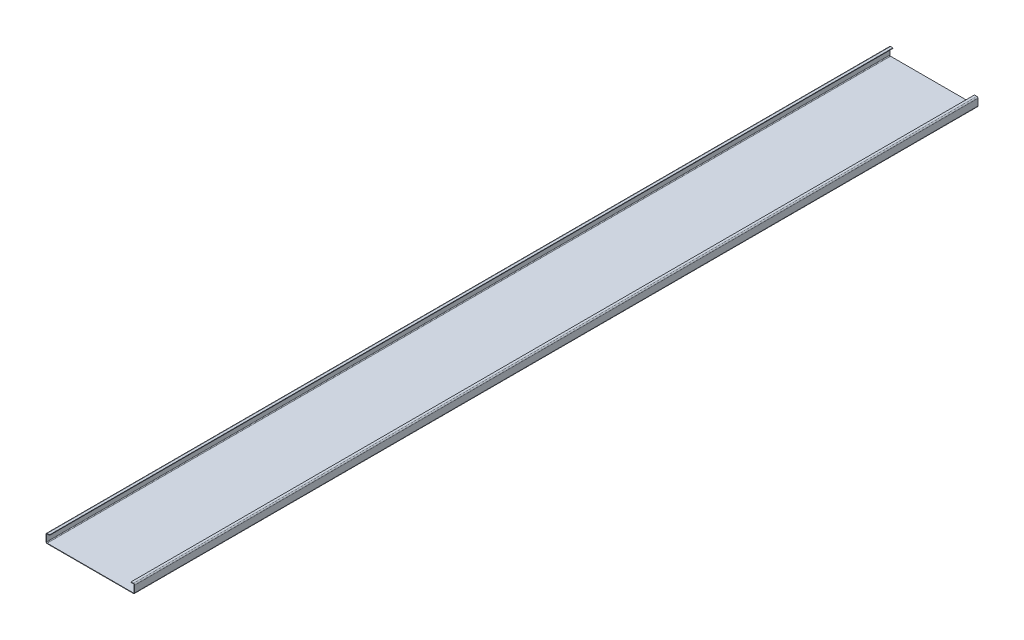
ISO-10303-21;
HEADER;
FILE_DESCRIPTION(('STEP AP214'),'2;1');
FILE_NAME('part.step','',(''),(''),'','','');
FILE_SCHEMA(('AUTOMOTIVE_DESIGN { 1 0 10303 214 1 1 1 1 }'));
ENDSEC;
DATA;
#1=APPLICATION_CONTEXT('core data for automotive mechanical design processes');
#2=APPLICATION_PROTOCOL_DEFINITION('international standard','automotive_design',2000,#1);
#3=PRODUCT_CONTEXT('',#1,'mechanical');
#4=PRODUCT('Part','Part','',(#3));
#5=PRODUCT_RELATED_PRODUCT_CATEGORY('part','',(#4));
#6=PRODUCT_DEFINITION_FORMATION('','',#4);
#7=PRODUCT_DEFINITION_CONTEXT('part definition',#1,'design');
#8=PRODUCT_DEFINITION('design','',#6,#7);
#9=PRODUCT_DEFINITION_SHAPE('','',#8);
#10=(LENGTH_UNIT() NAMED_UNIT(*) SI_UNIT(.MILLI.,.METRE.));
#11=(NAMED_UNIT(*) PLANE_ANGLE_UNIT() SI_UNIT($,.RADIAN.));
#12=(NAMED_UNIT(*) SI_UNIT($,.STERADIAN.) SOLID_ANGLE_UNIT());
#13=UNCERTAINTY_MEASURE_WITH_UNIT(LENGTH_MEASURE(1.E-05),#10,'distance_accuracy_value','');
#14=(GEOMETRIC_REPRESENTATION_CONTEXT(3) GLOBAL_UNCERTAINTY_ASSIGNED_CONTEXT((#13)) GLOBAL_UNIT_ASSIGNED_CONTEXT((#10,
#11,#12)) REPRESENTATION_CONTEXT('',''));
#15=CARTESIAN_POINT('',(0.,0.,0.));
#16=DIRECTION('',(0.,0.,1.));
#17=DIRECTION('',(1.,0.,0.));
#18=AXIS2_PLACEMENT_3D('',#15,#16,#17);
#19=CARTESIAN_POINT('',(3.25,25.,2380.));
#20=DIRECTION('',(0.,0.,1.));
#21=DIRECTION('',(1.,0.,0.));
#22=AXIS2_PLACEMENT_3D('',#19,#20,#21);
#23=PLANE('',#22);
#24=DIRECTION('',(0.,-1.,0.));
#25=VECTOR('',#24,1.);
#26=CARTESIAN_POINT('',(3.25,25.,2380.));
#27=LINE('',#26,#25);
#28=CARTESIAN_POINT('',(3.25,25.,2380.));
#29=VERTEX_POINT('',#28);
#30=CARTESIAN_POINT('',(3.25,23.75,2380.));
#31=VERTEX_POINT('',#30);
#32=EDGE_CURVE('E11',#29,#31,#27,.T.);
#33=ORIENTED_EDGE('',*,*,#32,.F.);
#34=CARTESIAN_POINT('',(3.25,21.75,2380.));
#35=DIRECTION('',(0.,0.,-1.));
#36=DIRECTION('',(-1.,0.,0.));
#37=AXIS2_PLACEMENT_3D('',#34,#35,#36);
#38=CIRCLE('',#37,3.25);
#39=CARTESIAN_POINT('',(0.,21.75,2380.));
#40=VERTEX_POINT('',#39);
#41=EDGE_CURVE('E361',#29,#40,#38,.F.);
#42=ORIENTED_EDGE('',*,*,#41,.T.);
#43=DIRECTION('',(-1.,0.,0.));
#44=VECTOR('',#43,1.);
#45=CARTESIAN_POINT('',(1.25,21.75,2380.));
#46=LINE('',#45,#44);
#47=CARTESIAN_POINT('',(1.25,21.75,2380.));
#48=VERTEX_POINT('',#47);
#49=EDGE_CURVE('E44',#48,#40,#46,.T.);
#50=ORIENTED_EDGE('',*,*,#49,.F.);
#51=CARTESIAN_POINT('',(3.25,21.75,2380.));
#52=DIRECTION('',(0.,0.,1.));
#53=DIRECTION('',(1.,0.,0.));
#54=AXIS2_PLACEMENT_3D('',#51,#52,#53);
#55=CIRCLE('',#54,2.);
#56=EDGE_CURVE('E436',#31,#48,#55,.T.);
#57=ORIENTED_EDGE('',*,*,#56,.F.);
#58=EDGE_LOOP('',(#33,#42,#50,#57));
#59=FACE_BOUND('',#58,.T.);
#60=ADVANCED_FACE('F36',(#59),#23,.T.);
#61=CARTESIAN_POINT('',(1.25,21.75,2380.));
#62=DIRECTION('',(0.,0.,1.));
#63=DIRECTION('',(1.,0.,0.));
#64=AXIS2_PLACEMENT_3D('',#61,#62,#63);
#65=PLANE('',#64);
#66=DIRECTION('',(-1.,0.,0.));
#67=VECTOR('',#66,1.);
#68=CARTESIAN_POINT('',(10.,25.,2380.));
#69=LINE('',#68,#67);
#70=CARTESIAN_POINT('',(10.,25.,2380.));
#71=VERTEX_POINT('',#70);
#72=EDGE_CURVE('E365',#71,#29,#69,.T.);
#73=ORIENTED_EDGE('',*,*,#72,.T.);
#74=ORIENTED_EDGE('',*,*,#32,.T.);
#75=DIRECTION('',(1.,0.,0.));
#76=VECTOR('',#75,1.);
#77=CARTESIAN_POINT('',(10.,23.75,2380.));
#78=LINE('',#77,#76);
#79=CARTESIAN_POINT('',(10.,23.75,2380.));
#80=VERTEX_POINT('',#79);
#81=EDGE_CURVE('E438',#80,#31,#78,.F.);
#82=ORIENTED_EDGE('',*,*,#81,.F.);
#83=DIRECTION('',(0.,-1.,0.));
#84=VECTOR('',#83,1.);
#85=CARTESIAN_POINT('',(10.,25.,2380.));
#86=LINE('',#85,#84);
#87=EDGE_CURVE('E441',#71,#80,#86,.T.);
#88=ORIENTED_EDGE('',*,*,#87,.F.);
#89=EDGE_LOOP('',(#73,#74,#82,#88));
#90=FACE_BOUND('',#89,.T.);
#91=ADVANCED_FACE('F447',(#90),#65,.T.);
#92=CARTESIAN_POINT('',(0.,21.75,0.));
#93=DIRECTION('',(0.,0.,-1.));
#94=DIRECTION('',(-1.,0.,0.));
#95=AXIS2_PLACEMENT_3D('',#92,#93,#94);
#96=PLANE('',#95);
#97=DIRECTION('',(1.,0.,0.));
#98=VECTOR('',#97,1.);
#99=CARTESIAN_POINT('',(0.,21.75,0.));
#100=LINE('',#99,#98);
#101=CARTESIAN_POINT('',(0.,21.75,0.));
#102=VERTEX_POINT('',#101);
#103=CARTESIAN_POINT('',(1.25,21.75,0.));
#104=VERTEX_POINT('',#103);
#105=EDGE_CURVE('E345',#102,#104,#100,.T.);
#106=ORIENTED_EDGE('',*,*,#105,.F.);
#107=CARTESIAN_POINT('',(3.25,21.75,0.));
#108=DIRECTION('',(0.,0.,-1.));
#109=DIRECTION('',(-1.,0.,0.));
#110=AXIS2_PLACEMENT_3D('',#107,#108,#109);
#111=CIRCLE('',#110,3.25);
#112=CARTESIAN_POINT('',(3.25,25.,0.));
#113=VERTEX_POINT('',#112);
#114=EDGE_CURVE('E261',#113,#102,#111,.F.);
#115=ORIENTED_EDGE('',*,*,#114,.F.);
#116=DIRECTION('',(0.,1.,0.));
#117=VECTOR('',#116,1.);
#118=CARTESIAN_POINT('',(3.25,23.75,0.));
#119=LINE('',#118,#117);
#120=CARTESIAN_POINT('',(3.25,23.75,0.));
#121=VERTEX_POINT('',#120);
#122=EDGE_CURVE('E343',#121,#113,#119,.T.);
#123=ORIENTED_EDGE('',*,*,#122,.F.);
#124=CARTESIAN_POINT('',(3.25,21.75,0.));
#125=DIRECTION('',(0.,0.,1.));
#126=DIRECTION('',(1.,0.,0.));
#127=AXIS2_PLACEMENT_3D('',#124,#125,#126);
#128=CIRCLE('',#127,2.);
#129=EDGE_CURVE('E249',#121,#104,#128,.T.);
#130=ORIENTED_EDGE('',*,*,#129,.T.);
#131=EDGE_LOOP('',(#106,#115,#123,#130));
#132=FACE_BOUND('',#131,.T.);
#133=ADVANCED_FACE('F454',(#132),#96,.T.);
#134=CARTESIAN_POINT('',(3.25,23.75,0.));
#135=DIRECTION('',(0.,0.,-1.));
#136=DIRECTION('',(-1.,0.,0.));
#137=AXIS2_PLACEMENT_3D('',#134,#135,#136);
#138=PLANE('',#137);
#139=DIRECTION('',(0.,-1.,0.));
#140=VECTOR('',#139,1.);
#141=CARTESIAN_POINT('',(0.,25.,0.));
#142=LINE('',#141,#140);
#143=CARTESIAN_POINT('',(0.,3.25,0.));
#144=VERTEX_POINT('',#143);
#145=EDGE_CURVE('E264',#102,#144,#142,.T.);
#146=ORIENTED_EDGE('',*,*,#145,.F.);
#147=ORIENTED_EDGE('',*,*,#105,.T.);
#148=DIRECTION('',(0.,-1.,0.));
#149=VECTOR('',#148,1.);
#150=CARTESIAN_POINT('',(1.25,25.,0.));
#151=LINE('',#150,#149);
#152=CARTESIAN_POINT('',(1.25,3.25,0.));
#153=VERTEX_POINT('',#152);
#154=EDGE_CURVE('E246',#104,#153,#151,.T.);
#155=ORIENTED_EDGE('',*,*,#154,.T.);
#156=DIRECTION('',(-1.,0.,0.));
#157=VECTOR('',#156,1.);
#158=CARTESIAN_POINT('',(1.25,3.25,0.));
#159=LINE('',#158,#157);
#160=EDGE_CURVE('E335',#153,#144,#159,.T.);
#161=ORIENTED_EDGE('',*,*,#160,.T.);
#162=EDGE_LOOP('',(#146,#147,#155,#161));
#163=FACE_BOUND('',#162,.T.);
#164=ADVANCED_FACE('F457',(#163),#138,.T.);
#165=CARTESIAN_POINT('',(0.,3.25,2380.));
#166=DIRECTION('',(0.,0.,1.));
#167=DIRECTION('',(1.,0.,0.));
#168=AXIS2_PLACEMENT_3D('',#165,#166,#167);
#169=PLANE('',#168);
#170=DIRECTION('',(1.,0.,0.));
#171=VECTOR('',#170,1.);
#172=CARTESIAN_POINT('',(0.,3.25,2380.));
#173=LINE('',#172,#171);
#174=CARTESIAN_POINT('',(0.,3.25,2380.));
#175=VERTEX_POINT('',#174);
#176=CARTESIAN_POINT('',(1.25,3.25,2380.));
#177=VERTEX_POINT('',#176);
#178=EDGE_CURVE('E341',#175,#177,#173,.T.);
#179=ORIENTED_EDGE('',*,*,#178,.F.);
#180=CARTESIAN_POINT('',(3.25,3.25,2380.));
#181=DIRECTION('',(0.,0.,-1.));
#182=DIRECTION('',(-1.,0.,0.));
#183=AXIS2_PLACEMENT_3D('',#180,#181,#182);
#184=CIRCLE('',#183,3.25);
#185=CARTESIAN_POINT('',(3.25,0.,2380.));
#186=VERTEX_POINT('',#185);
#187=EDGE_CURVE('E373',#175,#186,#184,.F.);
#188=ORIENTED_EDGE('',*,*,#187,.T.);
#189=DIRECTION('',(0.,-1.,0.));
#190=VECTOR('',#189,1.);
#191=CARTESIAN_POINT('',(3.25,1.25,2380.));
#192=LINE('',#191,#190);
#193=CARTESIAN_POINT('',(3.25,1.25,2380.));
#194=VERTEX_POINT('',#193);
#195=EDGE_CURVE('E339',#194,#186,#192,.T.);
#196=ORIENTED_EDGE('',*,*,#195,.F.);
#197=CARTESIAN_POINT('',(3.25,3.25,2380.));
#198=DIRECTION('',(0.,0.,1.));
#199=DIRECTION('',(1.,0.,0.));
#200=AXIS2_PLACEMENT_3D('',#197,#198,#199);
#201=CIRCLE('',#200,2.);
#202=EDGE_CURVE('E432',#177,#194,#201,.T.);
#203=ORIENTED_EDGE('',*,*,#202,.F.);
#204=EDGE_LOOP('',(#179,#188,#196,#203));
#205=FACE_BOUND('',#204,.T.);
#206=ADVANCED_FACE('F477',(#205),#169,.T.);
#207=CARTESIAN_POINT('',(3.25,1.25,2380.));
#208=DIRECTION('',(0.,0.,1.));
#209=DIRECTION('',(1.,0.,0.));
#210=AXIS2_PLACEMENT_3D('',#207,#208,#209);
#211=PLANE('',#210);
#212=DIRECTION('',(0.,-1.,0.));
#213=VECTOR('',#212,1.);
#214=CARTESIAN_POINT('',(0.,25.,2380.));
#215=LINE('',#214,#213);
#216=EDGE_CURVE('E352',#40,#175,#215,.T.);
#217=ORIENTED_EDGE('',*,*,#216,.T.);
#218=ORIENTED_EDGE('',*,*,#178,.T.);
#219=DIRECTION('',(0.,-1.,0.));
#220=VECTOR('',#219,1.);
#221=CARTESIAN_POINT('',(1.25,25.,2380.));
#222=LINE('',#221,#220);
#223=EDGE_CURVE('E355',#48,#177,#222,.T.);
#224=ORIENTED_EDGE('',*,*,#223,.F.);
#225=ORIENTED_EDGE('',*,*,#49,.T.);
#226=EDGE_LOOP('',(#217,#218,#224,#225));
#227=FACE_BOUND('',#226,.T.);
#228=ADVANCED_FACE('F350',(#227),#211,.T.);
#229=CARTESIAN_POINT('',(3.25,0.,0.));
#230=DIRECTION('',(0.,0.,-1.));
#231=DIRECTION('',(-1.,0.,0.));
#232=AXIS2_PLACEMENT_3D('',#229,#230,#231);
#233=PLANE('',#232);
#234=DIRECTION('',(0.,1.,0.));
#235=VECTOR('',#234,1.);
#236=CARTESIAN_POINT('',(3.25,0.,0.));
#237=LINE('',#236,#235);
#238=CARTESIAN_POINT('',(3.25,0.,0.));
#239=VERTEX_POINT('',#238);
#240=CARTESIAN_POINT('',(3.25,1.25,0.));
#241=VERTEX_POINT('',#240);
#242=EDGE_CURVE('E337',#239,#241,#237,.T.);
#243=ORIENTED_EDGE('',*,*,#242,.F.);
#244=CARTESIAN_POINT('',(3.25,3.25,0.));
#245=DIRECTION('',(0.,0.,-1.));
#246=DIRECTION('',(-1.,0.,0.));
#247=AXIS2_PLACEMENT_3D('',#244,#245,#246);
#248=CIRCLE('',#247,3.25);
#249=EDGE_CURVE('E267',#144,#239,#248,.F.);
#250=ORIENTED_EDGE('',*,*,#249,.F.);
#251=ORIENTED_EDGE('',*,*,#160,.F.);
#252=CARTESIAN_POINT('',(3.25,3.25,0.));
#253=DIRECTION('',(0.,0.,1.));
#254=DIRECTION('',(1.,0.,0.));
#255=AXIS2_PLACEMENT_3D('',#252,#253,#254);
#256=CIRCLE('',#255,2.);
#257=EDGE_CURVE('E243',#153,#241,#256,.T.);
#258=ORIENTED_EDGE('',*,*,#257,.T.);
#259=EDGE_LOOP('',(#243,#250,#251,#258));
#260=FACE_BOUND('',#259,.T.);
#261=ADVANCED_FACE('F471',(#260),#233,.T.);
#262=CARTESIAN_POINT('',(1.25,3.25,0.));
#263=DIRECTION('',(0.,0.,-1.));
#264=DIRECTION('',(-1.,0.,0.));
#265=AXIS2_PLACEMENT_3D('',#262,#263,#264);
#266=PLANE('',#265);
#267=DIRECTION('',(1.,0.,0.));
#268=VECTOR('',#267,1.);
#269=CARTESIAN_POINT('',(0.,0.,0.));
#270=LINE('',#269,#268);
#271=CARTESIAN_POINT('',(246.75,0.,0.));
#272=VERTEX_POINT('',#271);
#273=EDGE_CURVE('E270',#239,#272,#270,.T.);
#274=ORIENTED_EDGE('',*,*,#273,.F.);
#275=ORIENTED_EDGE('',*,*,#242,.T.);
#276=DIRECTION('',(1.,0.,0.));
#277=VECTOR('',#276,1.);
#278=CARTESIAN_POINT('',(0.,1.25,0.));
#279=LINE('',#278,#277);
#280=CARTESIAN_POINT('',(246.75,1.25,0.));
#281=VERTEX_POINT('',#280);
#282=EDGE_CURVE('E240',#241,#281,#279,.T.);
#283=ORIENTED_EDGE('',*,*,#282,.T.);
#284=DIRECTION('',(0.,-1.,0.));
#285=VECTOR('',#284,1.);
#286=CARTESIAN_POINT('',(246.75,1.25,0.));
#287=LINE('',#286,#285);
#288=EDGE_CURVE('E331',#281,#272,#287,.T.);
#289=ORIENTED_EDGE('',*,*,#288,.T.);
#290=EDGE_LOOP('',(#274,#275,#283,#289));
#291=FACE_BOUND('',#290,.T.);
#292=ADVANCED_FACE('F481',(#291),#266,.T.);
#293=CARTESIAN_POINT('',(246.75,0.,2380.));
#294=DIRECTION('',(0.,0.,1.));
#295=DIRECTION('',(1.,0.,0.));
#296=AXIS2_PLACEMENT_3D('',#293,#294,#295);
#297=PLANE('',#296);
#298=DIRECTION('',(0.,1.,0.));
#299=VECTOR('',#298,1.);
#300=CARTESIAN_POINT('',(246.75,0.,2380.));
#301=LINE('',#300,#299);
#302=CARTESIAN_POINT('',(246.75,0.,2380.));
#303=VERTEX_POINT('',#302);
#304=CARTESIAN_POINT('',(246.75,1.25,2380.));
#305=VERTEX_POINT('',#304);
#306=EDGE_CURVE('E193',#303,#305,#301,.T.);
#307=ORIENTED_EDGE('',*,*,#306,.F.);
#308=CARTESIAN_POINT('',(246.75,3.25,2380.));
#309=DIRECTION('',(0.,0.,-1.));
#310=DIRECTION('',(-1.,0.,0.));
#311=AXIS2_PLACEMENT_3D('',#308,#309,#310);
#312=CIRCLE('',#311,3.25);
#313=CARTESIAN_POINT('',(250.,3.25,2380.));
#314=VERTEX_POINT('',#313);
#315=EDGE_CURVE('E197',#303,#314,#312,.F.);
#316=ORIENTED_EDGE('',*,*,#315,.T.);
#317=DIRECTION('',(1.,0.,0.));
#318=VECTOR('',#317,1.);
#319=CARTESIAN_POINT('',(248.75,3.25,2380.));
#320=LINE('',#319,#318);
#321=CARTESIAN_POINT('',(248.75,3.25,2380.));
#322=VERTEX_POINT('',#321);
#323=EDGE_CURVE('E181',#322,#314,#320,.T.);
#324=ORIENTED_EDGE('',*,*,#323,.F.);
#325=CARTESIAN_POINT('',(246.75,3.25,2380.));
#326=DIRECTION('',(0.,0.,1.));
#327=DIRECTION('',(1.,0.,0.));
#328=AXIS2_PLACEMENT_3D('',#325,#326,#327);
#329=CIRCLE('',#328,2.);
#330=EDGE_CURVE('E394',#305,#322,#329,.T.);
#331=ORIENTED_EDGE('',*,*,#330,.F.);
#332=EDGE_LOOP('',(#307,#316,#324,#331));
#333=FACE_BOUND('',#332,.T.);
#334=ADVANCED_FACE('F199',(#333),#297,.T.);
#335=CARTESIAN_POINT('',(248.75,3.25,2380.));
#336=DIRECTION('',(0.,0.,1.));
#337=DIRECTION('',(1.,0.,0.));
#338=AXIS2_PLACEMENT_3D('',#335,#336,#337);
#339=PLANE('',#338);
#340=DIRECTION('',(1.,0.,0.));
#341=VECTOR('',#340,1.);
#342=CARTESIAN_POINT('',(0.,0.,2380.));
#343=LINE('',#342,#341);
#344=EDGE_CURVE('E203',#186,#303,#343,.T.);
#345=ORIENTED_EDGE('',*,*,#344,.T.);
#346=ORIENTED_EDGE('',*,*,#306,.T.);
#347=DIRECTION('',(1.,0.,0.));
#348=VECTOR('',#347,1.);
#349=CARTESIAN_POINT('',(0.,1.25,2380.));
#350=LINE('',#349,#348);
#351=EDGE_CURVE('E429',#194,#305,#350,.T.);
#352=ORIENTED_EDGE('',*,*,#351,.F.);
#353=ORIENTED_EDGE('',*,*,#195,.T.);
#354=EDGE_LOOP('',(#345,#346,#352,#353));
#355=FACE_BOUND('',#354,.T.);
#356=ADVANCED_FACE('F381',(#355),#339,.T.);
#357=CARTESIAN_POINT('',(250.,3.25,0.));
#358=DIRECTION('',(0.,0.,-1.));
#359=DIRECTION('',(-1.,0.,0.));
#360=AXIS2_PLACEMENT_3D('',#357,#358,#359);
#361=PLANE('',#360);
#362=DIRECTION('',(-1.,0.,0.));
#363=VECTOR('',#362,1.);
#364=CARTESIAN_POINT('',(250.,3.25,0.));
#365=LINE('',#364,#363);
#366=CARTESIAN_POINT('',(250.,3.25,0.));
#367=VERTEX_POINT('',#366);
#368=CARTESIAN_POINT('',(248.75,3.25,0.));
#369=VERTEX_POINT('',#368);
#370=EDGE_CURVE('E194',#367,#369,#365,.T.);
#371=ORIENTED_EDGE('',*,*,#370,.F.);
#372=CARTESIAN_POINT('',(246.75,3.25,0.));
#373=DIRECTION('',(0.,0.,-1.));
#374=DIRECTION('',(-1.,0.,0.));
#375=AXIS2_PLACEMENT_3D('',#372,#373,#374);
#376=CIRCLE('',#375,3.25);
#377=EDGE_CURVE('E210',#272,#367,#376,.F.);
#378=ORIENTED_EDGE('',*,*,#377,.F.);
#379=ORIENTED_EDGE('',*,*,#288,.F.);
#380=CARTESIAN_POINT('',(246.75,3.25,0.));
#381=DIRECTION('',(0.,0.,1.));
#382=DIRECTION('',(1.,0.,0.));
#383=AXIS2_PLACEMENT_3D('',#380,#381,#382);
#384=CIRCLE('',#383,2.);
#385=EDGE_CURVE('E237',#281,#369,#384,.T.);
#386=ORIENTED_EDGE('',*,*,#385,.T.);
#387=EDGE_LOOP('',(#371,#378,#379,#386));
#388=FACE_BOUND('',#387,.T.);
#389=ADVANCED_FACE('F388',(#388),#361,.T.);
#390=CARTESIAN_POINT('',(246.75,1.25,0.));
#391=DIRECTION('',(0.,0.,-1.));
#392=DIRECTION('',(-1.,0.,0.));
#393=AXIS2_PLACEMENT_3D('',#390,#391,#392);
#394=PLANE('',#393);
#395=DIRECTION('',(0.,1.,0.));
#396=VECTOR('',#395,1.);
#397=CARTESIAN_POINT('',(250.,0.,0.));
#398=LINE('',#397,#396);
#399=CARTESIAN_POINT('',(250.,21.75,0.));
#400=VERTEX_POINT('',#399);
#401=EDGE_CURVE('E274',#367,#400,#398,.T.);
#402=ORIENTED_EDGE('',*,*,#401,.F.);
#403=ORIENTED_EDGE('',*,*,#370,.T.);
#404=DIRECTION('',(0.,1.,0.));
#405=VECTOR('',#404,1.);
#406=CARTESIAN_POINT('',(248.75,0.,0.));
#407=LINE('',#406,#405);
#408=CARTESIAN_POINT('',(248.75,21.75,0.));
#409=VERTEX_POINT('',#408);
#410=EDGE_CURVE('E235',#369,#409,#407,.T.);
#411=ORIENTED_EDGE('',*,*,#410,.T.);
#412=DIRECTION('',(1.,0.,0.));
#413=VECTOR('',#412,1.);
#414=CARTESIAN_POINT('',(248.75,21.75,0.));
#415=LINE('',#414,#413);
#416=EDGE_CURVE('E117',#409,#400,#415,.T.);
#417=ORIENTED_EDGE('',*,*,#416,.T.);
#418=EDGE_LOOP('',(#402,#403,#411,#417));
#419=FACE_BOUND('',#418,.T.);
#420=ADVANCED_FACE('F390',(#419),#394,.T.);
#421=CARTESIAN_POINT('',(250.,21.75,2380.));
#422=DIRECTION('',(0.,0.,1.));
#423=DIRECTION('',(1.,0.,0.));
#424=AXIS2_PLACEMENT_3D('',#421,#422,#423);
#425=PLANE('',#424);
#426=DIRECTION('',(-1.,0.,0.));
#427=VECTOR('',#426,1.);
#428=CARTESIAN_POINT('',(250.,21.75,2380.));
#429=LINE('',#428,#427);
#430=CARTESIAN_POINT('',(250.,21.75,2380.));
#431=VERTEX_POINT('',#430);
#432=CARTESIAN_POINT('',(248.75,21.75,2380.));
#433=VERTEX_POINT('',#432);
#434=EDGE_CURVE('E329',#431,#433,#429,.T.);
#435=ORIENTED_EDGE('',*,*,#434,.F.);
#436=CARTESIAN_POINT('',(246.75,21.75,2380.));
#437=DIRECTION('',(0.,0.,-1.));
#438=DIRECTION('',(-1.,0.,0.));
#439=AXIS2_PLACEMENT_3D('',#436,#437,#438);
#440=CIRCLE('',#439,3.25);
#441=CARTESIAN_POINT('',(246.75,25.,2380.));
#442=VERTEX_POINT('',#441);
#443=EDGE_CURVE('E218',#431,#442,#440,.F.);
#444=ORIENTED_EDGE('',*,*,#443,.T.);
#445=DIRECTION('',(0.,1.,0.));
#446=VECTOR('',#445,1.);
#447=CARTESIAN_POINT('',(246.75,23.75,2380.));
#448=LINE('',#447,#446);
#449=CARTESIAN_POINT('',(246.75,23.75,2380.));
#450=VERTEX_POINT('',#449);
#451=EDGE_CURVE('E52',#450,#442,#448,.T.);
#452=ORIENTED_EDGE('',*,*,#451,.F.);
#453=CARTESIAN_POINT('',(246.75,21.75,2380.));
#454=DIRECTION('',(0.,0.,1.));
#455=DIRECTION('',(1.,0.,0.));
#456=AXIS2_PLACEMENT_3D('',#453,#454,#455);
#457=CIRCLE('',#456,2.);
#458=EDGE_CURVE('E422',#433,#450,#457,.T.);
#459=ORIENTED_EDGE('',*,*,#458,.F.);
#460=EDGE_LOOP('',(#435,#444,#452,#459));
#461=FACE_BOUND('',#460,.T.);
#462=ADVANCED_FACE('F552',(#461),#425,.T.);
#463=CARTESIAN_POINT('',(246.75,23.75,2380.));
#464=DIRECTION('',(0.,0.,1.));
#465=DIRECTION('',(1.,0.,0.));
#466=AXIS2_PLACEMENT_3D('',#463,#464,#465);
#467=PLANE('',#466);
#468=DIRECTION('',(0.,1.,0.));
#469=VECTOR('',#468,1.);
#470=CARTESIAN_POINT('',(250.,0.,2380.));
#471=LINE('',#470,#469);
#472=EDGE_CURVE('E185',#314,#431,#471,.T.);
#473=ORIENTED_EDGE('',*,*,#472,.T.);
#474=ORIENTED_EDGE('',*,*,#434,.T.);
#475=DIRECTION('',(0.,1.,0.));
#476=VECTOR('',#475,1.);
#477=CARTESIAN_POINT('',(248.75,0.,2380.));
#478=LINE('',#477,#476);
#479=EDGE_CURVE('E188',#322,#433,#478,.T.);
#480=ORIENTED_EDGE('',*,*,#479,.F.);
#481=ORIENTED_EDGE('',*,*,#323,.T.);
#482=EDGE_LOOP('',(#473,#474,#480,#481));
#483=FACE_BOUND('',#482,.T.);
#484=ADVANCED_FACE('F183',(#483),#467,.T.);
#485=CARTESIAN_POINT('',(246.75,25.,0.));
#486=DIRECTION('',(0.,0.,-1.));
#487=DIRECTION('',(-1.,0.,0.));
#488=AXIS2_PLACEMENT_3D('',#485,#486,#487);
#489=PLANE('',#488);
#490=DIRECTION('',(0.,-1.,0.));
#491=VECTOR('',#490,1.);
#492=CARTESIAN_POINT('',(246.75,25.,0.));
#493=LINE('',#492,#491);
#494=CARTESIAN_POINT('',(246.75,25.,0.));
#495=VERTEX_POINT('',#494);
#496=CARTESIAN_POINT('',(246.75,23.75,0.));
#497=VERTEX_POINT('',#496);
#498=EDGE_CURVE('E124',#495,#497,#493,.T.);
#499=ORIENTED_EDGE('',*,*,#498,.F.);
#500=CARTESIAN_POINT('',(246.75,21.75,0.));
#501=DIRECTION('',(0.,0.,-1.));
#502=DIRECTION('',(-1.,0.,0.));
#503=AXIS2_PLACEMENT_3D('',#500,#501,#502);
#504=CIRCLE('',#503,3.25);
#505=EDGE_CURVE('E276',#400,#495,#504,.F.);
#506=ORIENTED_EDGE('',*,*,#505,.F.);
#507=ORIENTED_EDGE('',*,*,#416,.F.);
#508=CARTESIAN_POINT('',(246.75,21.75,0.));
#509=DIRECTION('',(0.,0.,1.));
#510=DIRECTION('',(1.,0.,0.));
#511=AXIS2_PLACEMENT_3D('',#508,#509,#510);
#512=CIRCLE('',#511,2.);
#513=EDGE_CURVE('E233',#409,#497,#512,.T.);
#514=ORIENTED_EDGE('',*,*,#513,.T.);
#515=EDGE_LOOP('',(#499,#506,#507,#514));
#516=FACE_BOUND('',#515,.T.);
#517=ADVANCED_FACE('F405',(#516),#489,.T.);
#518=CARTESIAN_POINT('',(248.75,21.75,0.));
#519=DIRECTION('',(0.,0.,-1.));
#520=DIRECTION('',(-1.,0.,0.));
#521=AXIS2_PLACEMENT_3D('',#518,#519,#520);
#522=PLANE('',#521);
#523=DIRECTION('',(-1.,0.,0.));
#524=VECTOR('',#523,1.);
#525=CARTESIAN_POINT('',(250.,25.,0.));
#526=LINE('',#525,#524);
#527=CARTESIAN_POINT('',(240.,25.,0.));
#528=VERTEX_POINT('',#527);
#529=EDGE_CURVE('E224',#495,#528,#526,.T.);
#530=ORIENTED_EDGE('',*,*,#529,.F.);
#531=ORIENTED_EDGE('',*,*,#498,.T.);
#532=DIRECTION('',(1.,0.,0.));
#533=VECTOR('',#532,1.);
#534=CARTESIAN_POINT('',(250.,23.75,0.));
#535=LINE('',#534,#533);
#536=CARTESIAN_POINT('',(240.,23.75,0.));
#537=VERTEX_POINT('',#536);
#538=EDGE_CURVE('E230',#497,#537,#535,.F.);
#539=ORIENTED_EDGE('',*,*,#538,.T.);
#540=DIRECTION('',(0.,1.,0.));
#541=VECTOR('',#540,1.);
#542=CARTESIAN_POINT('',(240.,23.75,0.));
#543=LINE('',#542,#541);
#544=EDGE_CURVE('E227',#537,#528,#543,.T.);
#545=ORIENTED_EDGE('',*,*,#544,.T.);
#546=EDGE_LOOP('',(#530,#531,#539,#545));
#547=FACE_BOUND('',#546,.T.);
#548=ADVANCED_FACE('F413',(#547),#522,.T.);
#549=CARTESIAN_POINT('',(250.,25.,2380.));
#550=DIRECTION('',(0.,-1.,0.));
#551=DIRECTION('',(0.,0.,-1.));
#552=AXIS2_PLACEMENT_3D('',#549,#550,#551);
#553=PLANE('',#552);
#554=ORIENTED_EDGE('',*,*,#529,.T.);
#555=DIRECTION('',(0.,0.,-1.));
#556=VECTOR('',#555,1.);
#557=CARTESIAN_POINT('',(240.,25.,2380.));
#558=LINE('',#557,#556);
#559=CARTESIAN_POINT('',(240.,25.,2380.));
#560=VERTEX_POINT('',#559);
#561=EDGE_CURVE('E324',#560,#528,#558,.T.);
#562=ORIENTED_EDGE('',*,*,#561,.F.);
#563=DIRECTION('',(-1.,0.,0.));
#564=VECTOR('',#563,1.);
#565=CARTESIAN_POINT('',(250.,25.,2380.));
#566=LINE('',#565,#564);
#567=EDGE_CURVE('E130',#442,#560,#566,.T.);
#568=ORIENTED_EDGE('',*,*,#567,.F.);
#569=DIRECTION('',(0.,0.,-1.));
#570=VECTOR('',#569,1.);
#571=CARTESIAN_POINT('',(246.75,25.,2380.));
#572=LINE('',#571,#570);
#573=EDGE_CURVE('E220',#442,#495,#572,.T.);
#574=ORIENTED_EDGE('',*,*,#573,.T.);
#575=EDGE_LOOP('',(#554,#562,#568,#574));
#576=FACE_BOUND('',#575,.T.);
#577=ADVANCED_FACE('F411',(#576),#553,.F.);
#578=CARTESIAN_POINT('',(240.,23.75,2380.));
#579=DIRECTION('',(-1.,0.,0.));
#580=DIRECTION('',(0.,0.,1.));
#581=AXIS2_PLACEMENT_3D('',#578,#579,#580);
#582=PLANE('',#581);
#583=ORIENTED_EDGE('',*,*,#544,.F.);
#584=DIRECTION('',(0.,0.,-1.));
#585=VECTOR('',#584,1.);
#586=CARTESIAN_POINT('',(240.,23.75,2380.));
#587=LINE('',#586,#585);
#588=CARTESIAN_POINT('',(240.,23.75,2380.));
#589=VERTEX_POINT('',#588);
#590=EDGE_CURVE('E322',#589,#537,#587,.T.);
#591=ORIENTED_EDGE('',*,*,#590,.F.);
#592=DIRECTION('',(0.,1.,0.));
#593=VECTOR('',#592,1.);
#594=CARTESIAN_POINT('',(240.,23.75,2380.));
#595=LINE('',#594,#593);
#596=EDGE_CURVE('E418',#589,#560,#595,.T.);
#597=ORIENTED_EDGE('',*,*,#596,.T.);
#598=ORIENTED_EDGE('',*,*,#561,.T.);
#599=EDGE_LOOP('',(#583,#591,#597,#598));
#600=FACE_BOUND('',#599,.T.);
#601=ADVANCED_FACE('F416',(#600),#582,.T.);
#602=CARTESIAN_POINT('',(250.,23.75,2380.));
#603=DIRECTION('',(0.,-1.,0.));
#604=DIRECTION('',(0.,0.,-1.));
#605=AXIS2_PLACEMENT_3D('',#602,#603,#604);
#606=PLANE('',#605);
#607=ORIENTED_EDGE('',*,*,#538,.F.);
#608=DIRECTION('',(0.,0.,-1.));
#609=VECTOR('',#608,1.);
#610=CARTESIAN_POINT('',(246.75,23.75,2380.));
#611=LINE('',#610,#609);
#612=EDGE_CURVE('E319',#450,#497,#611,.T.);
#613=ORIENTED_EDGE('',*,*,#612,.F.);
#614=DIRECTION('',(1.,0.,0.));
#615=VECTOR('',#614,1.);
#616=CARTESIAN_POINT('',(250.,23.75,2380.));
#617=LINE('',#616,#615);
#618=EDGE_CURVE('E420',#450,#589,#617,.F.);
#619=ORIENTED_EDGE('',*,*,#618,.T.);
#620=ORIENTED_EDGE('',*,*,#590,.T.);
#621=EDGE_LOOP('',(#607,#613,#619,#620));
#622=FACE_BOUND('',#621,.T.);
#623=ADVANCED_FACE('F608',(#622),#606,.T.);
#624=CARTESIAN_POINT('',(246.75,21.75,2380.));
#625=DIRECTION('',(0.,0.,-1.));
#626=DIRECTION('',(-1.,0.,0.));
#627=AXIS2_PLACEMENT_3D('',#624,#625,#626);
#628=CYLINDRICAL_SURFACE('',#627,2.);
#629=ORIENTED_EDGE('',*,*,#513,.F.);
#630=DIRECTION('',(0.,0.,-1.));
#631=VECTOR('',#630,1.);
#632=CARTESIAN_POINT('',(248.75,21.75,2380.));
#633=LINE('',#632,#631);
#634=EDGE_CURVE('E316',#433,#409,#633,.T.);
#635=ORIENTED_EDGE('',*,*,#634,.F.);
#636=ORIENTED_EDGE('',*,*,#458,.T.);
#637=ORIENTED_EDGE('',*,*,#612,.T.);
#638=EDGE_LOOP('',(#629,#635,#636,#637));
#639=FACE_BOUND('',#638,.T.);
#640=ADVANCED_FACE('F402',(#639),#628,.F.);
#641=CARTESIAN_POINT('',(248.75,0.,2380.));
#642=DIRECTION('',(-1.,0.,0.));
#643=DIRECTION('',(0.,0.,1.));
#644=AXIS2_PLACEMENT_3D('',#641,#642,#643);
#645=PLANE('',#644);
#646=ORIENTED_EDGE('',*,*,#410,.F.);
#647=DIRECTION('',(0.,0.,-1.));
#648=VECTOR('',#647,1.);
#649=CARTESIAN_POINT('',(248.75,3.25,2380.));
#650=LINE('',#649,#648);
#651=EDGE_CURVE('E313',#322,#369,#650,.T.);
#652=ORIENTED_EDGE('',*,*,#651,.F.);
#653=ORIENTED_EDGE('',*,*,#479,.T.);
#654=ORIENTED_EDGE('',*,*,#634,.T.);
#655=EDGE_LOOP('',(#646,#652,#653,#654));
#656=FACE_BOUND('',#655,.T.);
#657=ADVANCED_FACE('F396',(#656),#645,.T.);
#658=CARTESIAN_POINT('',(246.75,3.25,2380.));
#659=DIRECTION('',(0.,0.,-1.));
#660=DIRECTION('',(-1.,0.,0.));
#661=AXIS2_PLACEMENT_3D('',#658,#659,#660);
#662=CYLINDRICAL_SURFACE('',#661,2.);
#663=ORIENTED_EDGE('',*,*,#385,.F.);
#664=DIRECTION('',(0.,0.,-1.));
#665=VECTOR('',#664,1.);
#666=CARTESIAN_POINT('',(246.75,1.25,2380.));
#667=LINE('',#666,#665);
#668=EDGE_CURVE('E310',#305,#281,#667,.T.);
#669=ORIENTED_EDGE('',*,*,#668,.F.);
#670=ORIENTED_EDGE('',*,*,#330,.T.);
#671=ORIENTED_EDGE('',*,*,#651,.T.);
#672=EDGE_LOOP('',(#663,#669,#670,#671));
#673=FACE_BOUND('',#672,.T.);
#674=ADVANCED_FACE('F393',(#673),#662,.F.);
#675=CARTESIAN_POINT('',(0.,1.25,2380.));
#676=DIRECTION('',(0.,1.,0.));
#677=DIRECTION('',(0.,0.,1.));
#678=AXIS2_PLACEMENT_3D('',#675,#676,#677);
#679=PLANE('',#678);
#680=ORIENTED_EDGE('',*,*,#282,.F.);
#681=DIRECTION('',(0.,0.,-1.));
#682=VECTOR('',#681,1.);
#683=CARTESIAN_POINT('',(3.25,1.25,2380.));
#684=LINE('',#683,#682);
#685=EDGE_CURVE('E307',#194,#241,#684,.T.);
#686=ORIENTED_EDGE('',*,*,#685,.F.);
#687=ORIENTED_EDGE('',*,*,#351,.T.);
#688=ORIENTED_EDGE('',*,*,#668,.T.);
#689=EDGE_LOOP('',(#680,#686,#687,#688));
#690=FACE_BOUND('',#689,.T.);
#691=ADVANCED_FACE('F479',(#690),#679,.T.);
#692=CARTESIAN_POINT('',(3.25,3.25,2380.));
#693=DIRECTION('',(0.,0.,-1.));
#694=DIRECTION('',(-1.,0.,0.));
#695=AXIS2_PLACEMENT_3D('',#692,#693,#694);
#696=CYLINDRICAL_SURFACE('',#695,2.);
#697=ORIENTED_EDGE('',*,*,#257,.F.);
#698=DIRECTION('',(0.,0.,-1.));
#699=VECTOR('',#698,1.);
#700=CARTESIAN_POINT('',(1.25,3.25,2380.));
#701=LINE('',#700,#699);
#702=EDGE_CURVE('E304',#177,#153,#701,.T.);
#703=ORIENTED_EDGE('',*,*,#702,.F.);
#704=ORIENTED_EDGE('',*,*,#202,.T.);
#705=ORIENTED_EDGE('',*,*,#685,.T.);
#706=EDGE_LOOP('',(#697,#703,#704,#705));
#707=FACE_BOUND('',#706,.T.);
#708=ADVANCED_FACE('F467',(#707),#696,.F.);
#709=CARTESIAN_POINT('',(1.25,25.,2380.));
#710=DIRECTION('',(1.,0.,0.));
#711=DIRECTION('',(0.,1.,0.));
#712=AXIS2_PLACEMENT_3D('',#709,#710,#711);
#713=PLANE('',#712);
#714=ORIENTED_EDGE('',*,*,#154,.F.);
#715=DIRECTION('',(0.,0.,-1.));
#716=VECTOR('',#715,1.);
#717=CARTESIAN_POINT('',(1.25,21.75,2380.));
#718=LINE('',#717,#716);
#719=EDGE_CURVE('E301',#48,#104,#718,.T.);
#720=ORIENTED_EDGE('',*,*,#719,.F.);
#721=ORIENTED_EDGE('',*,*,#223,.T.);
#722=ORIENTED_EDGE('',*,*,#702,.T.);
#723=EDGE_LOOP('',(#714,#720,#721,#722));
#724=FACE_BOUND('',#723,.T.);
#725=ADVANCED_FACE('F462',(#724),#713,.T.);
#726=CARTESIAN_POINT('',(3.25,21.75,2380.));
#727=DIRECTION('',(0.,0.,-1.));
#728=DIRECTION('',(-1.,0.,0.));
#729=AXIS2_PLACEMENT_3D('',#726,#727,#728);
#730=CYLINDRICAL_SURFACE('',#729,2.);
#731=ORIENTED_EDGE('',*,*,#129,.F.);
#732=DIRECTION('',(0.,0.,-1.));
#733=VECTOR('',#732,1.);
#734=CARTESIAN_POINT('',(3.25,23.75,2380.));
#735=LINE('',#734,#733);
#736=EDGE_CURVE('E298',#31,#121,#735,.T.);
#737=ORIENTED_EDGE('',*,*,#736,.F.);
#738=ORIENTED_EDGE('',*,*,#56,.T.);
#739=ORIENTED_EDGE('',*,*,#719,.T.);
#740=EDGE_LOOP('',(#731,#737,#738,#739));
#741=FACE_BOUND('',#740,.T.);
#742=ADVANCED_FACE('F460',(#741),#730,.F.);
#743=CARTESIAN_POINT('',(10.,23.75,2380.));
#744=DIRECTION('',(0.,-1.,0.));
#745=DIRECTION('',(0.,0.,-1.));
#746=AXIS2_PLACEMENT_3D('',#743,#744,#745);
#747=PLANE('',#746);
#748=DIRECTION('',(1.,0.,0.));
#749=VECTOR('',#748,1.);
#750=CARTESIAN_POINT('',(10.,23.75,0.));
#751=LINE('',#750,#749);
#752=CARTESIAN_POINT('',(10.,23.75,0.));
#753=VERTEX_POINT('',#752);
#754=EDGE_CURVE('E252',#753,#121,#751,.F.);
#755=ORIENTED_EDGE('',*,*,#754,.F.);
#756=DIRECTION('',(0.,0.,-1.));
#757=VECTOR('',#756,1.);
#758=CARTESIAN_POINT('',(10.,23.75,2380.));
#759=LINE('',#758,#757);
#760=EDGE_CURVE('E296',#80,#753,#759,.T.);
#761=ORIENTED_EDGE('',*,*,#760,.F.);
#762=ORIENTED_EDGE('',*,*,#81,.T.);
#763=ORIENTED_EDGE('',*,*,#736,.T.);
#764=EDGE_LOOP('',(#755,#761,#762,#763));
#765=FACE_BOUND('',#764,.T.);
#766=ADVANCED_FACE('F682',(#765),#747,.T.);
#767=CARTESIAN_POINT('',(10.,25.,2380.));
#768=DIRECTION('',(1.,0.,0.));
#769=DIRECTION('',(0.,0.,-1.));
#770=AXIS2_PLACEMENT_3D('',#767,#768,#769);
#771=PLANE('',#770);
#772=DIRECTION('',(0.,-1.,0.));
#773=VECTOR('',#772,1.);
#774=CARTESIAN_POINT('',(10.,25.,0.));
#775=LINE('',#774,#773);
#776=CARTESIAN_POINT('',(10.,25.,0.));
#777=VERTEX_POINT('',#776);
#778=EDGE_CURVE('E255',#777,#753,#775,.T.);
#779=ORIENTED_EDGE('',*,*,#778,.F.);
#780=DIRECTION('',(0.,0.,-1.));
#781=VECTOR('',#780,1.);
#782=CARTESIAN_POINT('',(10.,25.,2380.));
#783=LINE('',#782,#781);
#784=EDGE_CURVE('E294',#71,#777,#783,.T.);
#785=ORIENTED_EDGE('',*,*,#784,.F.);
#786=ORIENTED_EDGE('',*,*,#87,.T.);
#787=ORIENTED_EDGE('',*,*,#760,.T.);
#788=EDGE_LOOP('',(#779,#785,#786,#787));
#789=FACE_BOUND('',#788,.T.);
#790=ADVANCED_FACE('F692',(#789),#771,.T.);
#791=CARTESIAN_POINT('',(10.,25.,2380.));
#792=DIRECTION('',(0.,-1.,0.));
#793=DIRECTION('',(0.,0.,-1.));
#794=AXIS2_PLACEMENT_3D('',#791,#792,#793);
#795=PLANE('',#794);
#796=DIRECTION('',(-1.,0.,0.));
#797=VECTOR('',#796,1.);
#798=CARTESIAN_POINT('',(10.,25.,0.));
#799=LINE('',#798,#797);
#800=EDGE_CURVE('E258',#777,#113,#799,.T.);
#801=ORIENTED_EDGE('',*,*,#800,.T.);
#802=DIRECTION('',(0.,0.,-1.));
#803=VECTOR('',#802,1.);
#804=CARTESIAN_POINT('',(3.25,25.,2380.));
#805=LINE('',#804,#803);
#806=EDGE_CURVE('E291',#29,#113,#805,.T.);
#807=ORIENTED_EDGE('',*,*,#806,.F.);
#808=ORIENTED_EDGE('',*,*,#72,.F.);
#809=ORIENTED_EDGE('',*,*,#784,.T.);
#810=EDGE_LOOP('',(#801,#807,#808,#809));
#811=FACE_BOUND('',#810,.T.);
#812=ADVANCED_FACE('F451',(#811),#795,.F.);
#813=CARTESIAN_POINT('',(3.25,21.75,2380.));
#814=DIRECTION('',(0.,0.,-1.));
#815=DIRECTION('',(-1.,0.,0.));
#816=AXIS2_PLACEMENT_3D('',#813,#814,#815);
#817=CYLINDRICAL_SURFACE('',#816,3.25);
#818=ORIENTED_EDGE('',*,*,#114,.T.);
#819=DIRECTION('',(0.,0.,-1.));
#820=VECTOR('',#819,1.);
#821=CARTESIAN_POINT('',(0.,21.75,2380.));
#822=LINE('',#821,#820);
#823=EDGE_CURVE('E288',#40,#102,#822,.T.);
#824=ORIENTED_EDGE('',*,*,#823,.F.);
#825=ORIENTED_EDGE('',*,*,#41,.F.);
#826=ORIENTED_EDGE('',*,*,#806,.T.);
#827=EDGE_LOOP('',(#818,#824,#825,#826));
#828=FACE_BOUND('',#827,.T.);
#829=ADVANCED_FACE('F367',(#828),#817,.T.);
#830=CARTESIAN_POINT('',(0.,25.,2380.));
#831=DIRECTION('',(1.,0.,0.));
#832=DIRECTION('',(0.,1.,0.));
#833=AXIS2_PLACEMENT_3D('',#830,#831,#832);
#834=PLANE('',#833);
#835=ORIENTED_EDGE('',*,*,#145,.T.);
#836=DIRECTION('',(0.,0.,-1.));
#837=VECTOR('',#836,1.);
#838=CARTESIAN_POINT('',(0.,3.25,2380.));
#839=LINE('',#838,#837);
#840=EDGE_CURVE('E285',#175,#144,#839,.T.);
#841=ORIENTED_EDGE('',*,*,#840,.F.);
#842=ORIENTED_EDGE('',*,*,#216,.F.);
#843=ORIENTED_EDGE('',*,*,#823,.T.);
#844=EDGE_LOOP('',(#835,#841,#842,#843));
#845=FACE_BOUND('',#844,.T.);
#846=ADVANCED_FACE('F371',(#845),#834,.F.);
#847=CARTESIAN_POINT('',(3.25,3.25,2380.));
#848=DIRECTION('',(0.,0.,-1.));
#849=DIRECTION('',(-1.,0.,0.));
#850=AXIS2_PLACEMENT_3D('',#847,#848,#849);
#851=CYLINDRICAL_SURFACE('',#850,3.25);
#852=ORIENTED_EDGE('',*,*,#249,.T.);
#853=DIRECTION('',(0.,0.,-1.));
#854=VECTOR('',#853,1.);
#855=CARTESIAN_POINT('',(3.25,0.,2380.));
#856=LINE('',#855,#854);
#857=EDGE_CURVE('E282',#186,#239,#856,.T.);
#858=ORIENTED_EDGE('',*,*,#857,.F.);
#859=ORIENTED_EDGE('',*,*,#187,.F.);
#860=ORIENTED_EDGE('',*,*,#840,.T.);
#861=EDGE_LOOP('',(#852,#858,#859,#860));
#862=FACE_BOUND('',#861,.T.);
#863=ADVANCED_FACE('F474',(#862),#851,.T.);
#864=CARTESIAN_POINT('',(0.,0.,2380.));
#865=DIRECTION('',(0.,1.,0.));
#866=DIRECTION('',(0.,0.,1.));
#867=AXIS2_PLACEMENT_3D('',#864,#865,#866);
#868=PLANE('',#867);
#869=ORIENTED_EDGE('',*,*,#273,.T.);
#870=DIRECTION('',(0.,0.,-1.));
#871=VECTOR('',#870,1.);
#872=CARTESIAN_POINT('',(246.75,0.,2380.));
#873=LINE('',#872,#871);
#874=EDGE_CURVE('E212',#303,#272,#873,.T.);
#875=ORIENTED_EDGE('',*,*,#874,.F.);
#876=ORIENTED_EDGE('',*,*,#344,.F.);
#877=ORIENTED_EDGE('',*,*,#857,.T.);
#878=EDGE_LOOP('',(#869,#875,#876,#877));
#879=FACE_BOUND('',#878,.T.);
#880=ADVANCED_FACE('F385',(#879),#868,.F.);
#881=CARTESIAN_POINT('',(246.75,3.25,2380.));
#882=DIRECTION('',(0.,0.,-1.));
#883=DIRECTION('',(-1.,0.,0.));
#884=AXIS2_PLACEMENT_3D('',#881,#882,#883);
#885=CYLINDRICAL_SURFACE('',#884,3.25);
#886=ORIENTED_EDGE('',*,*,#377,.T.);
#887=DIRECTION('',(0.,0.,-1.));
#888=VECTOR('',#887,1.);
#889=CARTESIAN_POINT('',(250.,3.25,2380.));
#890=LINE('',#889,#888);
#891=EDGE_CURVE('E207',#314,#367,#890,.T.);
#892=ORIENTED_EDGE('',*,*,#891,.F.);
#893=ORIENTED_EDGE('',*,*,#315,.F.);
#894=ORIENTED_EDGE('',*,*,#874,.T.);
#895=EDGE_LOOP('',(#886,#892,#893,#894));
#896=FACE_BOUND('',#895,.T.);
#897=ADVANCED_FACE('F208',(#896),#885,.T.);
#898=CARTESIAN_POINT('',(250.,0.,2380.));
#899=DIRECTION('',(-1.,0.,0.));
#900=DIRECTION('',(0.,0.,1.));
#901=AXIS2_PLACEMENT_3D('',#898,#899,#900);
#902=PLANE('',#901);
#903=ORIENTED_EDGE('',*,*,#401,.T.);
#904=DIRECTION('',(0.,0.,-1.));
#905=VECTOR('',#904,1.);
#906=CARTESIAN_POINT('',(250.,21.75,2380.));
#907=LINE('',#906,#905);
#908=EDGE_CURVE('E213',#431,#400,#907,.T.);
#909=ORIENTED_EDGE('',*,*,#908,.F.);
#910=ORIENTED_EDGE('',*,*,#472,.F.);
#911=ORIENTED_EDGE('',*,*,#891,.T.);
#912=EDGE_LOOP('',(#903,#909,#910,#911));
#913=FACE_BOUND('',#912,.T.);
#914=ADVANCED_FACE('F215',(#913),#902,.F.);
#915=CARTESIAN_POINT('',(246.75,21.75,2380.));
#916=DIRECTION('',(0.,0.,-1.));
#917=DIRECTION('',(-1.,0.,0.));
#918=AXIS2_PLACEMENT_3D('',#915,#916,#917);
#919=CYLINDRICAL_SURFACE('',#918,3.25);
#920=ORIENTED_EDGE('',*,*,#505,.T.);
#921=ORIENTED_EDGE('',*,*,#573,.F.);
#922=ORIENTED_EDGE('',*,*,#443,.F.);
#923=ORIENTED_EDGE('',*,*,#908,.T.);
#924=EDGE_LOOP('',(#920,#921,#922,#923));
#925=FACE_BOUND('',#924,.T.);
#926=ADVANCED_FACE('F408',(#925),#919,.T.);
#927=CARTESIAN_POINT('',(246.75,21.75,2380.));
#928=DIRECTION('',(0.,0.,1.));
#929=DIRECTION('',(1.,0.,0.));
#930=AXIS2_PLACEMENT_3D('',#927,#928,#929);
#931=PLANE('',#930);
#932=ORIENTED_EDGE('',*,*,#567,.T.);
#933=ORIENTED_EDGE('',*,*,#596,.F.);
#934=ORIENTED_EDGE('',*,*,#618,.F.);
#935=ORIENTED_EDGE('',*,*,#451,.T.);
#936=EDGE_LOOP('',(#932,#933,#934,#935));
#937=FACE_BOUND('',#936,.T.);
#938=ADVANCED_FACE('F776',(#937),#931,.T.);
#939=CARTESIAN_POINT('',(246.75,21.75,0.));
#940=DIRECTION('',(0.,0.,1.));
#941=DIRECTION('',(1.,0.,0.));
#942=AXIS2_PLACEMENT_3D('',#939,#940,#941);
#943=PLANE('',#942);
#944=ORIENTED_EDGE('',*,*,#754,.T.);
#945=ORIENTED_EDGE('',*,*,#122,.T.);
#946=ORIENTED_EDGE('',*,*,#800,.F.);
#947=ORIENTED_EDGE('',*,*,#778,.T.);
#948=EDGE_LOOP('',(#944,#945,#946,#947));
#949=FACE_BOUND('',#948,.T.);
#950=ADVANCED_FACE('F786',(#949),#943,.F.);
#951=CLOSED_SHELL('',(#60,#91,#133,#164,#206,#228,#261,#292,#334,#356,#389,#420,#462,#484,#517,
#548,#577,#601,#623,#640,#657,#674,#691,#708,#725,#742,#766,#790,#812,#829,#846,#863,#880,#897,
#914,#926,#938,#950));
#952=MANIFOLD_SOLID_BREP('B2',#951);
#953=ADVANCED_BREP_SHAPE_REPRESENTATION('',(#18,#952),#14);
#954=SHAPE_DEFINITION_REPRESENTATION(#9,#953);
ENDSEC;
END-ISO-10303-21;
